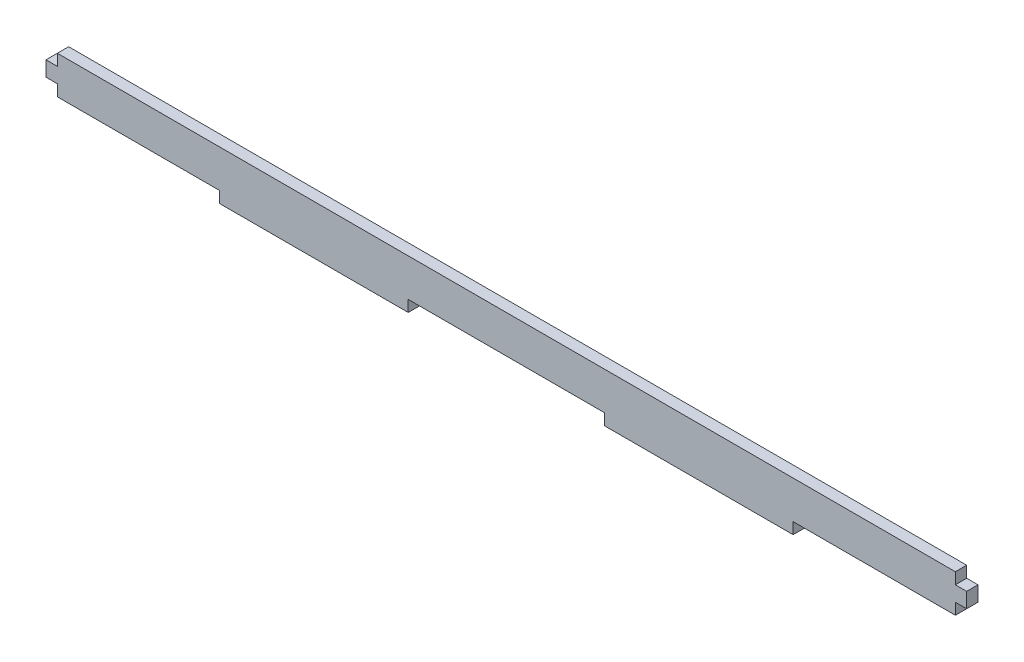
ISO-10303-21;
HEADER;
FILE_DESCRIPTION(('STEP AP214'),'2;1');
FILE_NAME('part.step','',(''),(''),'','','');
FILE_SCHEMA(('AUTOMOTIVE_DESIGN { 1 0 10303 214 1 1 1 1 }'));
ENDSEC;
DATA;
#1=APPLICATION_CONTEXT('core data for automotive mechanical design processes');
#2=APPLICATION_PROTOCOL_DEFINITION('international standard','automotive_design',2000,#1);
#3=PRODUCT_CONTEXT('',#1,'mechanical');
#4=PRODUCT('Part','Part','',(#3));
#5=PRODUCT_RELATED_PRODUCT_CATEGORY('part','',(#4));
#6=PRODUCT_DEFINITION_FORMATION('','',#4);
#7=PRODUCT_DEFINITION_CONTEXT('part definition',#1,'design');
#8=PRODUCT_DEFINITION('design','',#6,#7);
#9=PRODUCT_DEFINITION_SHAPE('','',#8);
#10=(LENGTH_UNIT() NAMED_UNIT(*) SI_UNIT(.MILLI.,.METRE.));
#11=(NAMED_UNIT(*) PLANE_ANGLE_UNIT() SI_UNIT($,.RADIAN.));
#12=(NAMED_UNIT(*) SI_UNIT($,.STERADIAN.) SOLID_ANGLE_UNIT());
#13=UNCERTAINTY_MEASURE_WITH_UNIT(LENGTH_MEASURE(1.E-05),#10,'distance_accuracy_value','');
#14=(GEOMETRIC_REPRESENTATION_CONTEXT(3) GLOBAL_UNCERTAINTY_ASSIGNED_CONTEXT((#13)) GLOBAL_UNIT_ASSIGNED_CONTEXT((#10,
#11,#12)) REPRESENTATION_CONTEXT('',''));
#15=CARTESIAN_POINT('',(0.,0.,0.));
#16=DIRECTION('',(0.,0.,1.));
#17=DIRECTION('',(1.,0.,0.));
#18=AXIS2_PLACEMENT_3D('',#15,#16,#17);
#19=CARTESIAN_POINT('',(0.,0.,3.));
#20=DIRECTION('',(1.,0.,0.));
#21=DIRECTION('',(0.,1.,0.));
#22=AXIS2_PLACEMENT_3D('',#19,#20,#21);
#23=PLANE('',#22);
#24=DIRECTION('',(0.,-1.,0.));
#25=VECTOR('',#24,1.);
#26=CARTESIAN_POINT('',(0.,0.,0.));
#27=LINE('',#26,#25);
#28=CARTESIAN_POINT('',(0.,3.,0.));
#29=VERTEX_POINT('',#28);
#30=CARTESIAN_POINT('',(0.,0.,0.));
#31=VERTEX_POINT('',#30);
#32=EDGE_CURVE('E200',#29,#31,#27,.T.);
#33=ORIENTED_EDGE('',*,*,#32,.T.);
#34=DIRECTION('',(0.,0.,-1.));
#35=VECTOR('',#34,1.);
#36=CARTESIAN_POINT('',(0.,0.,3.));
#37=LINE('',#36,#35);
#38=CARTESIAN_POINT('',(0.,0.,3.));
#39=VERTEX_POINT('',#38);
#40=EDGE_CURVE('E11',#39,#31,#37,.T.);
#41=ORIENTED_EDGE('',*,*,#40,.F.);
#42=DIRECTION('',(0.,-1.,0.));
#43=VECTOR('',#42,1.);
#44=CARTESIAN_POINT('',(0.,0.,3.));
#45=LINE('',#44,#43);
#46=CARTESIAN_POINT('',(0.,3.,3.));
#47=VERTEX_POINT('',#46);
#48=EDGE_CURVE('E238',#47,#39,#45,.T.);
#49=ORIENTED_EDGE('',*,*,#48,.F.);
#50=DIRECTION('',(0.,0.,-1.));
#51=VECTOR('',#50,1.);
#52=CARTESIAN_POINT('',(0.,3.,3.));
#53=LINE('',#52,#51);
#54=EDGE_CURVE('E196',#47,#29,#53,.T.);
#55=ORIENTED_EDGE('',*,*,#54,.T.);
#56=EDGE_LOOP('',(#33,#41,#49,#55));
#57=FACE_BOUND('',#56,.T.);
#58=ADVANCED_FACE('F32',(#57),#23,.F.);
#59=CARTESIAN_POINT('',(0.,0.,3.));
#60=DIRECTION('',(0.,1.,0.));
#61=DIRECTION('',(0.,0.,1.));
#62=AXIS2_PLACEMENT_3D('',#59,#60,#61);
#63=PLANE('',#62);
#64=DIRECTION('',(1.,0.,0.));
#65=VECTOR('',#64,1.);
#66=CARTESIAN_POINT('',(0.,0.,0.));
#67=LINE('',#66,#65);
#68=CARTESIAN_POINT('',(43.,0.,0.));
#69=VERTEX_POINT('',#68);
#70=EDGE_CURVE('E203',#31,#69,#67,.T.);
#71=ORIENTED_EDGE('',*,*,#70,.T.);
#72=DIRECTION('',(0.,0.,-1.));
#73=VECTOR('',#72,1.);
#74=CARTESIAN_POINT('',(43.,0.,3.));
#75=LINE('',#74,#73);
#76=CARTESIAN_POINT('',(43.,0.,3.));
#77=VERTEX_POINT('',#76);
#78=EDGE_CURVE('E40',#77,#69,#75,.T.);
#79=ORIENTED_EDGE('',*,*,#78,.F.);
#80=DIRECTION('',(1.,0.,0.));
#81=VECTOR('',#80,1.);
#82=CARTESIAN_POINT('',(0.,0.,3.));
#83=LINE('',#82,#81);
#84=EDGE_CURVE('E127',#39,#77,#83,.T.);
#85=ORIENTED_EDGE('',*,*,#84,.F.);
#86=ORIENTED_EDGE('',*,*,#40,.T.);
#87=EDGE_LOOP('',(#71,#79,#85,#86));
#88=FACE_BOUND('',#87,.T.);
#89=ADVANCED_FACE('F356',(#88),#63,.F.);
#90=CARTESIAN_POINT('',(43.,0.,3.));
#91=DIRECTION('',(1.,0.,0.));
#92=DIRECTION('',(0.,0.,-1.));
#93=AXIS2_PLACEMENT_3D('',#90,#91,#92);
#94=PLANE('',#93);
#95=DIRECTION('',(0.,-1.,0.));
#96=VECTOR('',#95,1.);
#97=CARTESIAN_POINT('',(43.,0.,0.));
#98=LINE('',#97,#96);
#99=CARTESIAN_POINT('',(43.,-3.,0.));
#100=VERTEX_POINT('',#99);
#101=EDGE_CURVE('E205',#69,#100,#98,.T.);
#102=ORIENTED_EDGE('',*,*,#101,.T.);
#103=DIRECTION('',(0.,0.,-1.));
#104=VECTOR('',#103,1.);
#105=CARTESIAN_POINT('',(43.,-3.,3.));
#106=LINE('',#105,#104);
#107=CARTESIAN_POINT('',(43.,-3.,3.));
#108=VERTEX_POINT('',#107);
#109=EDGE_CURVE('E281',#108,#100,#106,.T.);
#110=ORIENTED_EDGE('',*,*,#109,.F.);
#111=DIRECTION('',(0.,-1.,0.));
#112=VECTOR('',#111,1.);
#113=CARTESIAN_POINT('',(43.,0.,3.));
#114=LINE('',#113,#112);
#115=EDGE_CURVE('E289',#77,#108,#114,.T.);
#116=ORIENTED_EDGE('',*,*,#115,.F.);
#117=ORIENTED_EDGE('',*,*,#78,.T.);
#118=EDGE_LOOP('',(#102,#110,#116,#117));
#119=FACE_BOUND('',#118,.T.);
#120=ADVANCED_FACE('F287',(#119),#94,.F.);
#121=CARTESIAN_POINT('',(43.,-3.,3.));
#122=DIRECTION('',(0.,1.,0.));
#123=DIRECTION('',(-1.,0.,0.));
#124=AXIS2_PLACEMENT_3D('',#121,#122,#123);
#125=PLANE('',#124);
#126=DIRECTION('',(1.,0.,0.));
#127=VECTOR('',#126,1.);
#128=CARTESIAN_POINT('',(43.,-3.,0.));
#129=LINE('',#128,#127);
#130=CARTESIAN_POINT('',(93.,-3.,0.));
#131=VERTEX_POINT('',#130);
#132=EDGE_CURVE('E207',#100,#131,#129,.T.);
#133=ORIENTED_EDGE('',*,*,#132,.T.);
#134=DIRECTION('',(0.,0.,-1.));
#135=VECTOR('',#134,1.);
#136=CARTESIAN_POINT('',(93.,-3.,3.));
#137=LINE('',#136,#135);
#138=CARTESIAN_POINT('',(93.,-3.,3.));
#139=VERTEX_POINT('',#138);
#140=EDGE_CURVE('E278',#139,#131,#137,.T.);
#141=ORIENTED_EDGE('',*,*,#140,.F.);
#142=DIRECTION('',(1.,0.,0.));
#143=VECTOR('',#142,1.);
#144=CARTESIAN_POINT('',(43.,-3.,3.));
#145=LINE('',#144,#143);
#146=EDGE_CURVE('E307',#108,#139,#145,.T.);
#147=ORIENTED_EDGE('',*,*,#146,.F.);
#148=ORIENTED_EDGE('',*,*,#109,.T.);
#149=EDGE_LOOP('',(#133,#141,#147,#148));
#150=FACE_BOUND('',#149,.T.);
#151=ADVANCED_FACE('F298',(#150),#125,.F.);
#152=CARTESIAN_POINT('',(93.,0.,3.));
#153=DIRECTION('',(-1.,0.,0.));
#154=DIRECTION('',(0.,0.,1.));
#155=AXIS2_PLACEMENT_3D('',#152,#153,#154);
#156=PLANE('',#155);
#157=DIRECTION('',(0.,1.,0.));
#158=VECTOR('',#157,1.);
#159=CARTESIAN_POINT('',(93.,0.,0.));
#160=LINE('',#159,#158);
#161=CARTESIAN_POINT('',(93.,0.,0.));
#162=VERTEX_POINT('',#161);
#163=EDGE_CURVE('E209',#131,#162,#160,.T.);
#164=ORIENTED_EDGE('',*,*,#163,.T.);
#165=DIRECTION('',(0.,0.,-1.));
#166=VECTOR('',#165,1.);
#167=CARTESIAN_POINT('',(93.,0.,3.));
#168=LINE('',#167,#166);
#169=CARTESIAN_POINT('',(93.,0.,3.));
#170=VERTEX_POINT('',#169);
#171=EDGE_CURVE('E275',#170,#162,#168,.T.);
#172=ORIENTED_EDGE('',*,*,#171,.F.);
#173=DIRECTION('',(0.,1.,0.));
#174=VECTOR('',#173,1.);
#175=CARTESIAN_POINT('',(93.,0.,3.));
#176=LINE('',#175,#174);
#177=EDGE_CURVE('E304',#139,#170,#176,.T.);
#178=ORIENTED_EDGE('',*,*,#177,.F.);
#179=ORIENTED_EDGE('',*,*,#140,.T.);
#180=EDGE_LOOP('',(#164,#172,#178,#179));
#181=FACE_BOUND('',#180,.T.);
#182=ADVANCED_FACE('F302',(#181),#156,.F.);
#183=CARTESIAN_POINT('',(93.,0.,3.));
#184=DIRECTION('',(0.,1.,0.));
#185=DIRECTION('',(0.,0.,1.));
#186=AXIS2_PLACEMENT_3D('',#183,#184,#185);
#187=PLANE('',#186);
#188=DIRECTION('',(1.,0.,0.));
#189=VECTOR('',#188,1.);
#190=CARTESIAN_POINT('',(93.,0.,0.));
#191=LINE('',#190,#189);
#192=CARTESIAN_POINT('',(145.,0.,0.));
#193=VERTEX_POINT('',#192);
#194=EDGE_CURVE('E211',#162,#193,#191,.T.);
#195=ORIENTED_EDGE('',*,*,#194,.T.);
#196=DIRECTION('',(0.,0.,-1.));
#197=VECTOR('',#196,1.);
#198=CARTESIAN_POINT('',(145.,0.,3.));
#199=LINE('',#198,#197);
#200=CARTESIAN_POINT('',(145.,0.,3.));
#201=VERTEX_POINT('',#200);
#202=EDGE_CURVE('E272',#201,#193,#199,.T.);
#203=ORIENTED_EDGE('',*,*,#202,.F.);
#204=DIRECTION('',(1.,0.,0.));
#205=VECTOR('',#204,1.);
#206=CARTESIAN_POINT('',(93.,0.,3.));
#207=LINE('',#206,#205);
#208=EDGE_CURVE('E306',#170,#201,#207,.T.);
#209=ORIENTED_EDGE('',*,*,#208,.F.);
#210=ORIENTED_EDGE('',*,*,#171,.T.);
#211=EDGE_LOOP('',(#195,#203,#209,#210));
#212=FACE_BOUND('',#211,.T.);
#213=ADVANCED_FACE('F369',(#212),#187,.F.);
#214=CARTESIAN_POINT('',(145.,0.,3.));
#215=DIRECTION('',(1.,0.,0.));
#216=DIRECTION('',(0.,0.,-1.));
#217=AXIS2_PLACEMENT_3D('',#214,#215,#216);
#218=PLANE('',#217);
#219=DIRECTION('',(0.,-1.,0.));
#220=VECTOR('',#219,1.);
#221=CARTESIAN_POINT('',(145.,0.,0.));
#222=LINE('',#221,#220);
#223=CARTESIAN_POINT('',(145.,-3.,0.));
#224=VERTEX_POINT('',#223);
#225=EDGE_CURVE('E213',#193,#224,#222,.T.);
#226=ORIENTED_EDGE('',*,*,#225,.T.);
#227=DIRECTION('',(0.,0.,-1.));
#228=VECTOR('',#227,1.);
#229=CARTESIAN_POINT('',(145.,-3.,3.));
#230=LINE('',#229,#228);
#231=CARTESIAN_POINT('',(145.,-3.,3.));
#232=VERTEX_POINT('',#231);
#233=EDGE_CURVE('E269',#232,#224,#230,.T.);
#234=ORIENTED_EDGE('',*,*,#233,.F.);
#235=DIRECTION('',(0.,-1.,0.));
#236=VECTOR('',#235,1.);
#237=CARTESIAN_POINT('',(145.,0.,3.));
#238=LINE('',#237,#236);
#239=EDGE_CURVE('E309',#201,#232,#238,.T.);
#240=ORIENTED_EDGE('',*,*,#239,.F.);
#241=ORIENTED_EDGE('',*,*,#202,.T.);
#242=EDGE_LOOP('',(#226,#234,#240,#241));
#243=FACE_BOUND('',#242,.T.);
#244=ADVANCED_FACE('F372',(#243),#218,.F.);
#245=CARTESIAN_POINT('',(145.,-3.,3.));
#246=DIRECTION('',(0.,1.,0.));
#247=DIRECTION('',(0.,0.,1.));
#248=AXIS2_PLACEMENT_3D('',#245,#246,#247);
#249=PLANE('',#248);
#250=DIRECTION('',(1.,0.,0.));
#251=VECTOR('',#250,1.);
#252=CARTESIAN_POINT('',(145.,-3.,0.));
#253=LINE('',#252,#251);
#254=CARTESIAN_POINT('',(195.,-3.,0.));
#255=VERTEX_POINT('',#254);
#256=EDGE_CURVE('E215',#224,#255,#253,.T.);
#257=ORIENTED_EDGE('',*,*,#256,.T.);
#258=DIRECTION('',(0.,0.,-1.));
#259=VECTOR('',#258,1.);
#260=CARTESIAN_POINT('',(195.,-3.,3.));
#261=LINE('',#260,#259);
#262=CARTESIAN_POINT('',(195.,-3.,3.));
#263=VERTEX_POINT('',#262);
#264=EDGE_CURVE('E266',#263,#255,#261,.T.);
#265=ORIENTED_EDGE('',*,*,#264,.F.);
#266=DIRECTION('',(1.,0.,0.));
#267=VECTOR('',#266,1.);
#268=CARTESIAN_POINT('',(145.,-3.,3.));
#269=LINE('',#268,#267);
#270=EDGE_CURVE('E315',#232,#263,#269,.T.);
#271=ORIENTED_EDGE('',*,*,#270,.F.);
#272=ORIENTED_EDGE('',*,*,#233,.T.);
#273=EDGE_LOOP('',(#257,#265,#271,#272));
#274=FACE_BOUND('',#273,.T.);
#275=ADVANCED_FACE('F376',(#274),#249,.F.);
#276=CARTESIAN_POINT('',(195.,0.,3.));
#277=DIRECTION('',(-1.,0.,0.));
#278=DIRECTION('',(0.,0.,1.));
#279=AXIS2_PLACEMENT_3D('',#276,#277,#278);
#280=PLANE('',#279);
#281=DIRECTION('',(0.,1.,0.));
#282=VECTOR('',#281,1.);
#283=CARTESIAN_POINT('',(195.,0.,0.));
#284=LINE('',#283,#282);
#285=CARTESIAN_POINT('',(195.,0.,0.));
#286=VERTEX_POINT('',#285);
#287=EDGE_CURVE('E217',#255,#286,#284,.T.);
#288=ORIENTED_EDGE('',*,*,#287,.T.);
#289=DIRECTION('',(0.,0.,-1.));
#290=VECTOR('',#289,1.);
#291=CARTESIAN_POINT('',(195.,0.,3.));
#292=LINE('',#291,#290);
#293=CARTESIAN_POINT('',(195.,0.,3.));
#294=VERTEX_POINT('',#293);
#295=EDGE_CURVE('E263',#294,#286,#292,.T.);
#296=ORIENTED_EDGE('',*,*,#295,.F.);
#297=DIRECTION('',(0.,1.,0.));
#298=VECTOR('',#297,1.);
#299=CARTESIAN_POINT('',(195.,0.,3.));
#300=LINE('',#299,#298);
#301=EDGE_CURVE('E317',#263,#294,#300,.T.);
#302=ORIENTED_EDGE('',*,*,#301,.F.);
#303=ORIENTED_EDGE('',*,*,#264,.T.);
#304=EDGE_LOOP('',(#288,#296,#302,#303));
#305=FACE_BOUND('',#304,.T.);
#306=ADVANCED_FACE('F380',(#305),#280,.F.);
#307=CARTESIAN_POINT('',(195.,0.,3.));
#308=DIRECTION('',(0.,1.,0.));
#309=DIRECTION('',(0.,0.,1.));
#310=AXIS2_PLACEMENT_3D('',#307,#308,#309);
#311=PLANE('',#310);
#312=DIRECTION('',(1.,0.,0.));
#313=VECTOR('',#312,1.);
#314=CARTESIAN_POINT('',(195.,0.,0.));
#315=LINE('',#314,#313);
#316=CARTESIAN_POINT('',(238.,0.,0.));
#317=VERTEX_POINT('',#316);
#318=EDGE_CURVE('E219',#286,#317,#315,.T.);
#319=ORIENTED_EDGE('',*,*,#318,.T.);
#320=DIRECTION('',(0.,0.,-1.));
#321=VECTOR('',#320,1.);
#322=CARTESIAN_POINT('',(238.,0.,3.));
#323=LINE('',#322,#321);
#324=CARTESIAN_POINT('',(238.,0.,3.));
#325=VERTEX_POINT('',#324);
#326=EDGE_CURVE('E260',#325,#317,#323,.T.);
#327=ORIENTED_EDGE('',*,*,#326,.F.);
#328=DIRECTION('',(1.,0.,0.));
#329=VECTOR('',#328,1.);
#330=CARTESIAN_POINT('',(195.,0.,3.));
#331=LINE('',#330,#329);
#332=EDGE_CURVE('E319',#294,#325,#331,.T.);
#333=ORIENTED_EDGE('',*,*,#332,.F.);
#334=ORIENTED_EDGE('',*,*,#295,.T.);
#335=EDGE_LOOP('',(#319,#327,#333,#334));
#336=FACE_BOUND('',#335,.T.);
#337=ADVANCED_FACE('F384',(#336),#311,.F.);
#338=CARTESIAN_POINT('',(238.,0.,3.));
#339=DIRECTION('',(-1.,0.,0.));
#340=DIRECTION('',(0.,0.,1.));
#341=AXIS2_PLACEMENT_3D('',#338,#339,#340);
#342=PLANE('',#341);
#343=DIRECTION('',(0.,1.,0.));
#344=VECTOR('',#343,1.);
#345=CARTESIAN_POINT('',(238.,0.,0.));
#346=LINE('',#345,#344);
#347=CARTESIAN_POINT('',(238.,3.,0.));
#348=VERTEX_POINT('',#347);
#349=EDGE_CURVE('E221',#317,#348,#346,.T.);
#350=ORIENTED_EDGE('',*,*,#349,.T.);
#351=DIRECTION('',(0.,0.,-1.));
#352=VECTOR('',#351,1.);
#353=CARTESIAN_POINT('',(238.,3.,3.));
#354=LINE('',#353,#352);
#355=CARTESIAN_POINT('',(238.,3.,3.));
#356=VERTEX_POINT('',#355);
#357=EDGE_CURVE('E257',#356,#348,#354,.T.);
#358=ORIENTED_EDGE('',*,*,#357,.F.);
#359=DIRECTION('',(0.,1.,0.));
#360=VECTOR('',#359,1.);
#361=CARTESIAN_POINT('',(238.,0.,3.));
#362=LINE('',#361,#360);
#363=EDGE_CURVE('E321',#325,#356,#362,.T.);
#364=ORIENTED_EDGE('',*,*,#363,.F.);
#365=ORIENTED_EDGE('',*,*,#326,.T.);
#366=EDGE_LOOP('',(#350,#358,#364,#365));
#367=FACE_BOUND('',#366,.T.);
#368=ADVANCED_FACE('F388',(#367),#342,.F.);
#369=CARTESIAN_POINT('',(238.,3.,3.));
#370=DIRECTION('',(0.,1.,0.));
#371=DIRECTION('',(-1.,0.,0.));
#372=AXIS2_PLACEMENT_3D('',#369,#370,#371);
#373=PLANE('',#372);
#374=DIRECTION('',(1.,0.,0.));
#375=VECTOR('',#374,1.);
#376=CARTESIAN_POINT('',(238.,3.,0.));
#377=LINE('',#376,#375);
#378=CARTESIAN_POINT('',(241.,3.,0.));
#379=VERTEX_POINT('',#378);
#380=EDGE_CURVE('E223',#348,#379,#377,.T.);
#381=ORIENTED_EDGE('',*,*,#380,.T.);
#382=DIRECTION('',(0.,0.,-1.));
#383=VECTOR('',#382,1.);
#384=CARTESIAN_POINT('',(241.,3.,3.));
#385=LINE('',#384,#383);
#386=CARTESIAN_POINT('',(241.,3.,3.));
#387=VERTEX_POINT('',#386);
#388=EDGE_CURVE('E254',#387,#379,#385,.T.);
#389=ORIENTED_EDGE('',*,*,#388,.F.);
#390=DIRECTION('',(1.,0.,0.));
#391=VECTOR('',#390,1.);
#392=CARTESIAN_POINT('',(238.,3.,3.));
#393=LINE('',#392,#391);
#394=EDGE_CURVE('E323',#356,#387,#393,.T.);
#395=ORIENTED_EDGE('',*,*,#394,.F.);
#396=ORIENTED_EDGE('',*,*,#357,.T.);
#397=EDGE_LOOP('',(#381,#389,#395,#396));
#398=FACE_BOUND('',#397,.T.);
#399=ADVANCED_FACE('F392',(#398),#373,.F.);
#400=CARTESIAN_POINT('',(241.,7.,3.));
#401=DIRECTION('',(-1.,0.,0.));
#402=DIRECTION('',(0.,0.,1.));
#403=AXIS2_PLACEMENT_3D('',#400,#401,#402);
#404=PLANE('',#403);
#405=DIRECTION('',(0.,1.,0.));
#406=VECTOR('',#405,1.);
#407=CARTESIAN_POINT('',(241.,7.,0.));
#408=LINE('',#407,#406);
#409=CARTESIAN_POINT('',(241.,7.,0.));
#410=VERTEX_POINT('',#409);
#411=EDGE_CURVE('E225',#379,#410,#408,.T.);
#412=ORIENTED_EDGE('',*,*,#411,.T.);
#413=DIRECTION('',(0.,0.,-1.));
#414=VECTOR('',#413,1.);
#415=CARTESIAN_POINT('',(241.,7.,3.));
#416=LINE('',#415,#414);
#417=CARTESIAN_POINT('',(241.,7.,3.));
#418=VERTEX_POINT('',#417);
#419=EDGE_CURVE('E251',#418,#410,#416,.T.);
#420=ORIENTED_EDGE('',*,*,#419,.F.);
#421=DIRECTION('',(0.,1.,0.));
#422=VECTOR('',#421,1.);
#423=CARTESIAN_POINT('',(241.,7.,3.));
#424=LINE('',#423,#422);
#425=EDGE_CURVE('E325',#387,#418,#424,.T.);
#426=ORIENTED_EDGE('',*,*,#425,.F.);
#427=ORIENTED_EDGE('',*,*,#388,.T.);
#428=EDGE_LOOP('',(#412,#420,#426,#427));
#429=FACE_BOUND('',#428,.T.);
#430=ADVANCED_FACE('F396',(#429),#404,.F.);
#431=CARTESIAN_POINT('',(238.,7.,3.));
#432=DIRECTION('',(0.,-1.,0.));
#433=DIRECTION('',(0.,0.,-1.));
#434=AXIS2_PLACEMENT_3D('',#431,#432,#433);
#435=PLANE('',#434);
#436=DIRECTION('',(-1.,0.,0.));
#437=VECTOR('',#436,1.);
#438=CARTESIAN_POINT('',(238.,7.,0.));
#439=LINE('',#438,#437);
#440=CARTESIAN_POINT('',(238.,7.,0.));
#441=VERTEX_POINT('',#440);
#442=EDGE_CURVE('E227',#410,#441,#439,.T.);
#443=ORIENTED_EDGE('',*,*,#442,.T.);
#444=DIRECTION('',(0.,0.,-1.));
#445=VECTOR('',#444,1.);
#446=CARTESIAN_POINT('',(238.,7.,3.));
#447=LINE('',#446,#445);
#448=CARTESIAN_POINT('',(238.,7.,3.));
#449=VERTEX_POINT('',#448);
#450=EDGE_CURVE('E248',#449,#441,#447,.T.);
#451=ORIENTED_EDGE('',*,*,#450,.F.);
#452=DIRECTION('',(-1.,0.,0.));
#453=VECTOR('',#452,1.);
#454=CARTESIAN_POINT('',(238.,7.,3.));
#455=LINE('',#454,#453);
#456=EDGE_CURVE('E327',#418,#449,#455,.T.);
#457=ORIENTED_EDGE('',*,*,#456,.F.);
#458=ORIENTED_EDGE('',*,*,#419,.T.);
#459=EDGE_LOOP('',(#443,#451,#457,#458));
#460=FACE_BOUND('',#459,.T.);
#461=ADVANCED_FACE('F400',(#460),#435,.F.);
#462=CARTESIAN_POINT('',(238.,7.,3.));
#463=DIRECTION('',(-1.,0.,0.));
#464=DIRECTION('',(0.,0.,1.));
#465=AXIS2_PLACEMENT_3D('',#462,#463,#464);
#466=PLANE('',#465);
#467=DIRECTION('',(0.,1.,0.));
#468=VECTOR('',#467,1.);
#469=CARTESIAN_POINT('',(238.,7.,0.));
#470=LINE('',#469,#468);
#471=CARTESIAN_POINT('',(238.,10.,0.));
#472=VERTEX_POINT('',#471);
#473=EDGE_CURVE('E229',#441,#472,#470,.T.);
#474=ORIENTED_EDGE('',*,*,#473,.T.);
#475=DIRECTION('',(0.,0.,-1.));
#476=VECTOR('',#475,1.);
#477=CARTESIAN_POINT('',(238.,10.,3.));
#478=LINE('',#477,#476);
#479=CARTESIAN_POINT('',(238.,10.,3.));
#480=VERTEX_POINT('',#479);
#481=EDGE_CURVE('E245',#480,#472,#478,.T.);
#482=ORIENTED_EDGE('',*,*,#481,.F.);
#483=DIRECTION('',(0.,1.,0.));
#484=VECTOR('',#483,1.);
#485=CARTESIAN_POINT('',(238.,7.,3.));
#486=LINE('',#485,#484);
#487=EDGE_CURVE('E329',#449,#480,#486,.T.);
#488=ORIENTED_EDGE('',*,*,#487,.F.);
#489=ORIENTED_EDGE('',*,*,#450,.T.);
#490=EDGE_LOOP('',(#474,#482,#488,#489));
#491=FACE_BOUND('',#490,.T.);
#492=ADVANCED_FACE('F404',(#491),#466,.F.);
#493=CARTESIAN_POINT('',(0.,10.,3.));
#494=DIRECTION('',(0.,-1.,0.));
#495=DIRECTION('',(0.,0.,-1.));
#496=AXIS2_PLACEMENT_3D('',#493,#494,#495);
#497=PLANE('',#496);
#498=DIRECTION('',(-1.,0.,0.));
#499=VECTOR('',#498,1.);
#500=CARTESIAN_POINT('',(0.,10.,0.));
#501=LINE('',#500,#499);
#502=CARTESIAN_POINT('',(0.,10.,0.));
#503=VERTEX_POINT('',#502);
#504=EDGE_CURVE('E231',#472,#503,#501,.T.);
#505=ORIENTED_EDGE('',*,*,#504,.T.);
#506=DIRECTION('',(0.,0.,-1.));
#507=VECTOR('',#506,1.);
#508=CARTESIAN_POINT('',(0.,10.,3.));
#509=LINE('',#508,#507);
#510=CARTESIAN_POINT('',(0.,10.,3.));
#511=VERTEX_POINT('',#510);
#512=EDGE_CURVE('E242',#511,#503,#509,.T.);
#513=ORIENTED_EDGE('',*,*,#512,.F.);
#514=DIRECTION('',(-1.,0.,0.));
#515=VECTOR('',#514,1.);
#516=CARTESIAN_POINT('',(0.,10.,3.));
#517=LINE('',#516,#515);
#518=EDGE_CURVE('E331',#480,#511,#517,.T.);
#519=ORIENTED_EDGE('',*,*,#518,.F.);
#520=ORIENTED_EDGE('',*,*,#481,.T.);
#521=EDGE_LOOP('',(#505,#513,#519,#520));
#522=FACE_BOUND('',#521,.T.);
#523=ADVANCED_FACE('F337',(#522),#497,.F.);
#524=CARTESIAN_POINT('',(0.,7.,3.));
#525=DIRECTION('',(1.,0.,0.));
#526=DIRECTION('',(0.,1.,0.));
#527=AXIS2_PLACEMENT_3D('',#524,#525,#526);
#528=PLANE('',#527);
#529=DIRECTION('',(0.,-1.,0.));
#530=VECTOR('',#529,1.);
#531=CARTESIAN_POINT('',(0.,7.,0.));
#532=LINE('',#531,#530);
#533=CARTESIAN_POINT('',(0.,7.,0.));
#534=VERTEX_POINT('',#533);
#535=EDGE_CURVE('E233',#503,#534,#532,.T.);
#536=ORIENTED_EDGE('',*,*,#535,.T.);
#537=DIRECTION('',(0.,0.,-1.));
#538=VECTOR('',#537,1.);
#539=CARTESIAN_POINT('',(0.,7.,3.));
#540=LINE('',#539,#538);
#541=CARTESIAN_POINT('',(0.,7.,3.));
#542=VERTEX_POINT('',#541);
#543=EDGE_CURVE('E191',#542,#534,#540,.T.);
#544=ORIENTED_EDGE('',*,*,#543,.F.);
#545=DIRECTION('',(0.,-1.,0.));
#546=VECTOR('',#545,1.);
#547=CARTESIAN_POINT('',(0.,7.,3.));
#548=LINE('',#547,#546);
#549=EDGE_CURVE('E182',#511,#542,#548,.T.);
#550=ORIENTED_EDGE('',*,*,#549,.F.);
#551=ORIENTED_EDGE('',*,*,#512,.T.);
#552=EDGE_LOOP('',(#536,#544,#550,#551));
#553=FACE_BOUND('',#552,.T.);
#554=ADVANCED_FACE('F341',(#553),#528,.F.);
#555=CARTESIAN_POINT('',(0.,7.,3.));
#556=DIRECTION('',(0.,-1.,0.));
#557=DIRECTION('',(0.,0.,-1.));
#558=AXIS2_PLACEMENT_3D('',#555,#556,#557);
#559=PLANE('',#558);
#560=DIRECTION('',(-1.,0.,0.));
#561=VECTOR('',#560,1.);
#562=CARTESIAN_POINT('',(0.,7.,0.));
#563=LINE('',#562,#561);
#564=CARTESIAN_POINT('',(-3.,7.,0.));
#565=VERTEX_POINT('',#564);
#566=EDGE_CURVE('E190',#534,#565,#563,.T.);
#567=ORIENTED_EDGE('',*,*,#566,.T.);
#568=DIRECTION('',(0.,0.,-1.));
#569=VECTOR('',#568,1.);
#570=CARTESIAN_POINT('',(-3.,7.,3.));
#571=LINE('',#570,#569);
#572=CARTESIAN_POINT('',(-3.,7.,3.));
#573=VERTEX_POINT('',#572);
#574=EDGE_CURVE('E187',#573,#565,#571,.T.);
#575=ORIENTED_EDGE('',*,*,#574,.F.);
#576=DIRECTION('',(-1.,0.,0.));
#577=VECTOR('',#576,1.);
#578=CARTESIAN_POINT('',(0.,7.,3.));
#579=LINE('',#578,#577);
#580=EDGE_CURVE('E176',#542,#573,#579,.T.);
#581=ORIENTED_EDGE('',*,*,#580,.F.);
#582=ORIENTED_EDGE('',*,*,#543,.T.);
#583=EDGE_LOOP('',(#567,#575,#581,#582));
#584=FACE_BOUND('',#583,.T.);
#585=ADVANCED_FACE('F188',(#584),#559,.F.);
#586=CARTESIAN_POINT('',(-3.,7.,3.));
#587=DIRECTION('',(1.,0.,0.));
#588=DIRECTION('',(0.,1.,0.));
#589=AXIS2_PLACEMENT_3D('',#586,#587,#588);
#590=PLANE('',#589);
#591=DIRECTION('',(0.,-1.,0.));
#592=VECTOR('',#591,1.);
#593=CARTESIAN_POINT('',(-3.,7.,0.));
#594=LINE('',#593,#592);
#595=CARTESIAN_POINT('',(-3.,3.,0.));
#596=VERTEX_POINT('',#595);
#597=EDGE_CURVE('E113',#565,#596,#594,.T.);
#598=ORIENTED_EDGE('',*,*,#597,.T.);
#599=DIRECTION('',(0.,0.,-1.));
#600=VECTOR('',#599,1.);
#601=CARTESIAN_POINT('',(-3.,3.,3.));
#602=LINE('',#601,#600);
#603=CARTESIAN_POINT('',(-3.,3.,3.));
#604=VERTEX_POINT('',#603);
#605=EDGE_CURVE('E192',#604,#596,#602,.T.);
#606=ORIENTED_EDGE('',*,*,#605,.F.);
#607=DIRECTION('',(0.,-1.,0.));
#608=VECTOR('',#607,1.);
#609=CARTESIAN_POINT('',(-3.,7.,3.));
#610=LINE('',#609,#608);
#611=EDGE_CURVE('E180',#573,#604,#610,.T.);
#612=ORIENTED_EDGE('',*,*,#611,.F.);
#613=ORIENTED_EDGE('',*,*,#574,.T.);
#614=EDGE_LOOP('',(#598,#606,#612,#613));
#615=FACE_BOUND('',#614,.T.);
#616=ADVANCED_FACE('F194',(#615),#590,.F.);
#617=CARTESIAN_POINT('',(0.,3.,3.));
#618=DIRECTION('',(0.,1.,0.));
#619=DIRECTION('',(-1.,0.,0.));
#620=AXIS2_PLACEMENT_3D('',#617,#618,#619);
#621=PLANE('',#620);
#622=DIRECTION('',(1.,0.,0.));
#623=VECTOR('',#622,1.);
#624=CARTESIAN_POINT('',(0.,3.,0.));
#625=LINE('',#624,#623);
#626=EDGE_CURVE('E119',#596,#29,#625,.T.);
#627=ORIENTED_EDGE('',*,*,#626,.T.);
#628=ORIENTED_EDGE('',*,*,#54,.F.);
#629=DIRECTION('',(1.,0.,0.));
#630=VECTOR('',#629,1.);
#631=CARTESIAN_POINT('',(0.,3.,3.));
#632=LINE('',#631,#630);
#633=EDGE_CURVE('E48',#604,#47,#632,.T.);
#634=ORIENTED_EDGE('',*,*,#633,.F.);
#635=ORIENTED_EDGE('',*,*,#605,.T.);
#636=EDGE_LOOP('',(#627,#628,#634,#635));
#637=FACE_BOUND('',#636,.T.);
#638=ADVANCED_FACE('F345',(#637),#621,.F.);
#639=CARTESIAN_POINT('',(0.,0.,3.));
#640=DIRECTION('',(0.,0.,1.));
#641=DIRECTION('',(1.,0.,0.));
#642=AXIS2_PLACEMENT_3D('',#639,#640,#641);
#643=PLANE('',#642);
#644=ORIENTED_EDGE('',*,*,#48,.T.);
#645=ORIENTED_EDGE('',*,*,#84,.T.);
#646=ORIENTED_EDGE('',*,*,#115,.T.);
#647=ORIENTED_EDGE('',*,*,#146,.T.);
#648=ORIENTED_EDGE('',*,*,#177,.T.);
#649=ORIENTED_EDGE('',*,*,#208,.T.);
#650=ORIENTED_EDGE('',*,*,#239,.T.);
#651=ORIENTED_EDGE('',*,*,#270,.T.);
#652=ORIENTED_EDGE('',*,*,#301,.T.);
#653=ORIENTED_EDGE('',*,*,#332,.T.);
#654=ORIENTED_EDGE('',*,*,#363,.T.);
#655=ORIENTED_EDGE('',*,*,#394,.T.);
#656=ORIENTED_EDGE('',*,*,#425,.T.);
#657=ORIENTED_EDGE('',*,*,#456,.T.);
#658=ORIENTED_EDGE('',*,*,#487,.T.);
#659=ORIENTED_EDGE('',*,*,#518,.T.);
#660=ORIENTED_EDGE('',*,*,#549,.T.);
#661=ORIENTED_EDGE('',*,*,#580,.T.);
#662=ORIENTED_EDGE('',*,*,#611,.T.);
#663=ORIENTED_EDGE('',*,*,#633,.T.);
#664=EDGE_LOOP('',(#644,#645,#646,#647,#648,#649,#650,#651,#652,#653,#654,#655,#656,#657,#658,
#659,#660,#661,#662,#663));
#665=FACE_BOUND('',#664,.T.);
#666=ADVANCED_FACE('F178',(#665),#643,.T.);
#667=CARTESIAN_POINT('',(0.,0.,0.));
#668=DIRECTION('',(0.,0.,1.));
#669=DIRECTION('',(1.,0.,0.));
#670=AXIS2_PLACEMENT_3D('',#667,#668,#669);
#671=PLANE('',#670);
#672=ORIENTED_EDGE('',*,*,#32,.F.);
#673=ORIENTED_EDGE('',*,*,#626,.F.);
#674=ORIENTED_EDGE('',*,*,#597,.F.);
#675=ORIENTED_EDGE('',*,*,#566,.F.);
#676=ORIENTED_EDGE('',*,*,#535,.F.);
#677=ORIENTED_EDGE('',*,*,#504,.F.);
#678=ORIENTED_EDGE('',*,*,#473,.F.);
#679=ORIENTED_EDGE('',*,*,#442,.F.);
#680=ORIENTED_EDGE('',*,*,#411,.F.);
#681=ORIENTED_EDGE('',*,*,#380,.F.);
#682=ORIENTED_EDGE('',*,*,#349,.F.);
#683=ORIENTED_EDGE('',*,*,#318,.F.);
#684=ORIENTED_EDGE('',*,*,#287,.F.);
#685=ORIENTED_EDGE('',*,*,#256,.F.);
#686=ORIENTED_EDGE('',*,*,#225,.F.);
#687=ORIENTED_EDGE('',*,*,#194,.F.);
#688=ORIENTED_EDGE('',*,*,#163,.F.);
#689=ORIENTED_EDGE('',*,*,#132,.F.);
#690=ORIENTED_EDGE('',*,*,#101,.F.);
#691=ORIENTED_EDGE('',*,*,#70,.F.);
#692=EDGE_LOOP('',(#672,#673,#674,#675,#676,#677,#678,#679,#680,#681,#682,#683,#684,#685,#686,
#687,#688,#689,#690,#691));
#693=FACE_BOUND('',#692,.T.);
#694=ADVANCED_FACE('F293',(#693),#671,.F.);
#695=CLOSED_SHELL('',(#58,#89,#120,#151,#182,#213,#244,#275,#306,#337,#368,#399,#430,#461,#492,
#523,#554,#585,#616,#638,#666,#694));
#696=MANIFOLD_SOLID_BREP('B2',#695);
#697=ADVANCED_BREP_SHAPE_REPRESENTATION('',(#18,#696),#14);
#698=SHAPE_DEFINITION_REPRESENTATION(#9,#697);
ENDSEC;
END-ISO-10303-21;
